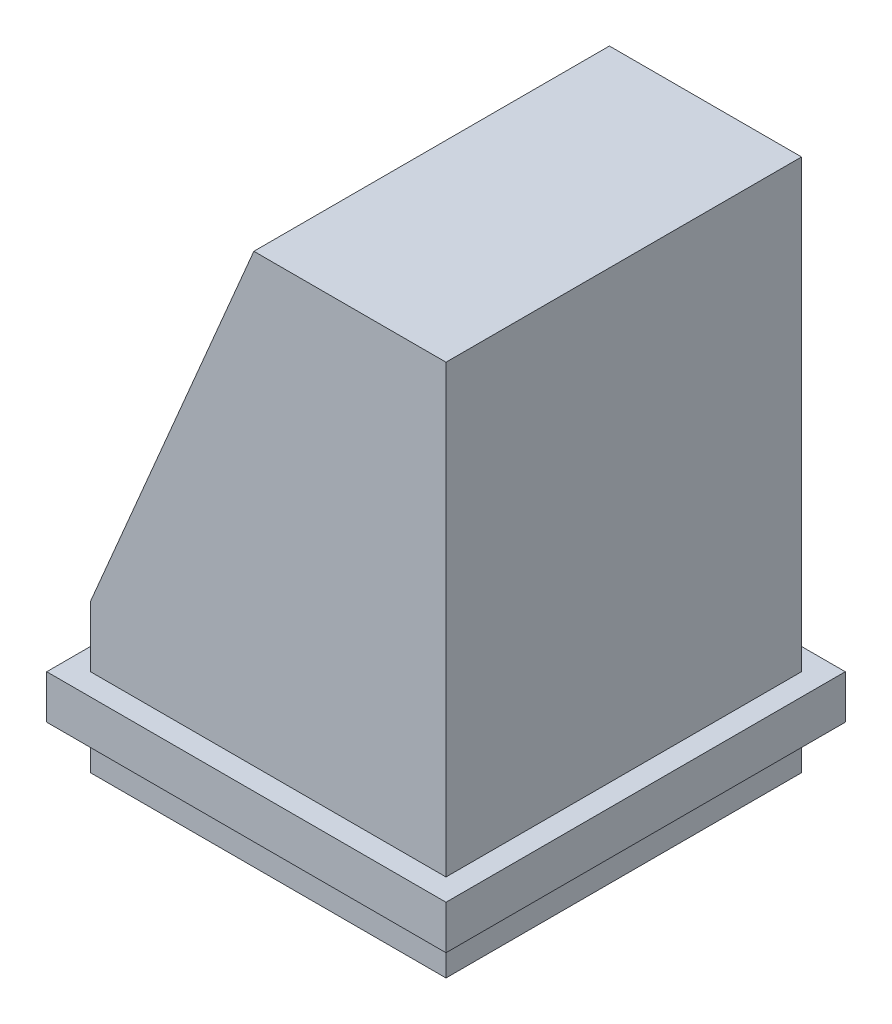
ISO-10303-21;
HEADER;
FILE_DESCRIPTION(('STEP AP214'),'2;1');
FILE_NAME('part.step','',(''),(''),'','','');
FILE_SCHEMA(('AUTOMOTIVE_DESIGN { 1 0 10303 214 1 1 1 1 }'));
ENDSEC;
DATA;
#1=APPLICATION_CONTEXT('core data for automotive mechanical design processes');
#2=APPLICATION_PROTOCOL_DEFINITION('international standard','automotive_design',2000,#1);
#3=PRODUCT_CONTEXT('',#1,'mechanical');
#4=PRODUCT('Part','Part','',(#3));
#5=PRODUCT_RELATED_PRODUCT_CATEGORY('part','',(#4));
#6=PRODUCT_DEFINITION_FORMATION('','',#4);
#7=PRODUCT_DEFINITION_CONTEXT('part definition',#1,'design');
#8=PRODUCT_DEFINITION('design','',#6,#7);
#9=PRODUCT_DEFINITION_SHAPE('','',#8);
#10=(LENGTH_UNIT() NAMED_UNIT(*) SI_UNIT(.MILLI.,.METRE.));
#11=(NAMED_UNIT(*) PLANE_ANGLE_UNIT() SI_UNIT($,.RADIAN.));
#12=(NAMED_UNIT(*) SI_UNIT($,.STERADIAN.) SOLID_ANGLE_UNIT());
#13=UNCERTAINTY_MEASURE_WITH_UNIT(LENGTH_MEASURE(1.E-05),#10,'distance_accuracy_value','');
#14=(GEOMETRIC_REPRESENTATION_CONTEXT(3) GLOBAL_UNCERTAINTY_ASSIGNED_CONTEXT((#13)) GLOBAL_UNIT_ASSIGNED_CONTEXT((#10,
#11,#12)) REPRESENTATION_CONTEXT('',''));
#15=CARTESIAN_POINT('',(0.,0.,0.));
#16=DIRECTION('',(0.,0.,1.));
#17=DIRECTION('',(1.,0.,0.));
#18=AXIS2_PLACEMENT_3D('',#15,#16,#17);
#19=CARTESIAN_POINT('',(0.,1219.2,0.));
#20=DIRECTION('',(1.,0.,0.));
#21=DIRECTION('',(0.,0.,-1.));
#22=AXIS2_PLACEMENT_3D('',#19,#20,#21);
#23=PLANE('',#22);
#24=DIRECTION('',(0.,-1.,0.));
#25=VECTOR('',#24,1.);
#26=CARTESIAN_POINT('',(0.,1219.2,0.));
#27=LINE('',#26,#25);
#28=CARTESIAN_POINT('',(0.,339.199999999993,0.));
#29=VERTEX_POINT('',#28);
#30=CARTESIAN_POINT('',(0.,200.000000000001,0.));
#31=VERTEX_POINT('',#30);
#32=EDGE_CURVE('E149',#29,#31,#27,.T.);
#33=ORIENTED_EDGE('',*,*,#32,.F.);
#34=DIRECTION('',(0.,0.,-1.));
#35=VECTOR('',#34,1.);
#36=CARTESIAN_POINT('',(0.,339.199999999993,0.));
#37=LINE('',#36,#35);
#38=CARTESIAN_POINT('',(0.,339.199999999993,-812.8));
#39=VERTEX_POINT('',#38);
#40=EDGE_CURVE('E41',#29,#39,#37,.T.);
#41=ORIENTED_EDGE('',*,*,#40,.T.);
#42=DIRECTION('',(0.,-1.,0.));
#43=VECTOR('',#42,1.);
#44=CARTESIAN_POINT('',(0.,1219.2,-812.8));
#45=LINE('',#44,#43);
#46=CARTESIAN_POINT('',(0.,200.000000000001,-812.8));
#47=VERTEX_POINT('',#46);
#48=EDGE_CURVE('E189',#39,#47,#45,.T.);
#49=ORIENTED_EDGE('',*,*,#48,.T.);
#50=DIRECTION('',(0.,0.,1.));
#51=VECTOR('',#50,1.);
#52=CARTESIAN_POINT('',(0.,200.,0.));
#53=LINE('',#52,#51);
#54=EDGE_CURVE('E251',#47,#31,#53,.T.);
#55=ORIENTED_EDGE('',*,*,#54,.T.);
#56=EDGE_LOOP('',(#33,#41,#49,#55));
#57=FACE_BOUND('',#56,.T.);
#58=ADVANCED_FACE('F33',(#57),#23,.F.);
#59=CARTESIAN_POINT('',(0.,1219.2,0.));
#60=DIRECTION('',(0.,0.,-1.));
#61=DIRECTION('',(-1.,0.,0.));
#62=AXIS2_PLACEMENT_3D('',#59,#60,#61);
#63=PLANE('',#62);
#64=DIRECTION('',(1.,0.,0.));
#65=VECTOR('',#64,1.);
#66=CARTESIAN_POINT('',(0.,1219.2,0.));
#67=LINE('',#66,#65);
#68=CARTESIAN_POINT('',(373.537838264453,1219.2,0.));
#69=VERTEX_POINT('',#68);
#70=CARTESIAN_POINT('',(812.8,1219.2,0.));
#71=VERTEX_POINT('',#70);
#72=EDGE_CURVE('E163',#69,#71,#67,.T.);
#73=ORIENTED_EDGE('',*,*,#72,.F.);
#74=DIRECTION('',(0.390731128489271,0.920504853452441,0.));
#75=VECTOR('',#74,1.);
#76=CARTESIAN_POINT('',(373.537838264453,1219.2,0.));
#77=LINE('',#76,#75);
#78=EDGE_CURVE('E55',#69,#29,#77,.F.);
#79=ORIENTED_EDGE('',*,*,#78,.T.);
#80=ORIENTED_EDGE('',*,*,#32,.T.);
#81=DIRECTION('',(1.,0.,0.));
#82=VECTOR('',#81,1.);
#83=CARTESIAN_POINT('',(0.,200.,0.));
#84=LINE('',#83,#82);
#85=CARTESIAN_POINT('',(812.8,200.000000000001,0.));
#86=VERTEX_POINT('',#85);
#87=EDGE_CURVE('E246',#31,#86,#84,.T.);
#88=ORIENTED_EDGE('',*,*,#87,.T.);
#89=DIRECTION('',(0.,-1.,0.));
#90=VECTOR('',#89,1.);
#91=CARTESIAN_POINT('',(812.8,1219.2,0.));
#92=LINE('',#91,#90);
#93=EDGE_CURVE('E150',#71,#86,#92,.T.);
#94=ORIENTED_EDGE('',*,*,#93,.F.);
#95=EDGE_LOOP('',(#73,#79,#80,#88,#94));
#96=FACE_BOUND('',#95,.T.);
#97=ADVANCED_FACE('F169',(#96),#63,.F.);
#98=CARTESIAN_POINT('',(812.8,1219.2,0.));
#99=DIRECTION('',(-1.,0.,0.));
#100=DIRECTION('',(0.,0.,1.));
#101=AXIS2_PLACEMENT_3D('',#98,#99,#100);
#102=PLANE('',#101);
#103=DIRECTION('',(0.,0.,-1.));
#104=VECTOR('',#103,1.);
#105=CARTESIAN_POINT('',(812.8,200.,0.));
#106=LINE('',#105,#104);
#107=CARTESIAN_POINT('',(812.8,200.,-812.8));
#108=VERTEX_POINT('',#107);
#109=EDGE_CURVE('E241',#86,#108,#106,.T.);
#110=ORIENTED_EDGE('',*,*,#109,.T.);
#111=DIRECTION('',(0.,-1.,0.));
#112=VECTOR('',#111,1.);
#113=CARTESIAN_POINT('',(812.8,1219.2,-812.8));
#114=LINE('',#113,#112);
#115=CARTESIAN_POINT('',(812.8,1219.2,-812.8));
#116=VERTEX_POINT('',#115);
#117=EDGE_CURVE('E191',#116,#108,#114,.T.);
#118=ORIENTED_EDGE('',*,*,#117,.F.);
#119=DIRECTION('',(0.,0.,-1.));
#120=VECTOR('',#119,1.);
#121=CARTESIAN_POINT('',(812.8,1219.2,0.));
#122=LINE('',#121,#120);
#123=EDGE_CURVE('E171',#71,#116,#122,.T.);
#124=ORIENTED_EDGE('',*,*,#123,.F.);
#125=ORIENTED_EDGE('',*,*,#93,.T.);
#126=EDGE_LOOP('',(#110,#118,#124,#125));
#127=FACE_BOUND('',#126,.T.);
#128=ADVANCED_FACE('F222',(#127),#102,.F.);
#129=CARTESIAN_POINT('',(0.,1219.2,-812.8));
#130=DIRECTION('',(0.,0.,1.));
#131=DIRECTION('',(1.,0.,0.));
#132=AXIS2_PLACEMENT_3D('',#129,#130,#131);
#133=PLANE('',#132);
#134=ORIENTED_EDGE('',*,*,#48,.F.);
#135=DIRECTION('',(-0.390731128489271,-0.920504853452441,0.));
#136=VECTOR('',#135,1.);
#137=CARTESIAN_POINT('',(373.537838264453,1219.2,-812.8));
#138=LINE('',#137,#136);
#139=CARTESIAN_POINT('',(373.537838264453,1219.2,-812.8));
#140=VERTEX_POINT('',#139);
#141=EDGE_CURVE('E11',#39,#140,#138,.F.);
#142=ORIENTED_EDGE('',*,*,#141,.T.);
#143=DIRECTION('',(-1.,0.,0.));
#144=VECTOR('',#143,1.);
#145=CARTESIAN_POINT('',(0.,1219.2,-812.8));
#146=LINE('',#145,#144);
#147=EDGE_CURVE('E166',#116,#140,#146,.T.);
#148=ORIENTED_EDGE('',*,*,#147,.F.);
#149=ORIENTED_EDGE('',*,*,#117,.T.);
#150=DIRECTION('',(-1.,0.,0.));
#151=VECTOR('',#150,1.);
#152=CARTESIAN_POINT('',(-2.22044604925031E-13,200.,-812.8));
#153=LINE('',#152,#151);
#154=EDGE_CURVE('E245',#108,#47,#153,.T.);
#155=ORIENTED_EDGE('',*,*,#154,.T.);
#156=EDGE_LOOP('',(#134,#142,#148,#149,#155));
#157=FACE_BOUND('',#156,.T.);
#158=ADVANCED_FACE('F213',(#157),#133,.F.);
#159=CARTESIAN_POINT('',(0.,1219.2,0.));
#160=DIRECTION('',(0.,-1.,0.));
#161=DIRECTION('',(0.,0.,-1.));
#162=AXIS2_PLACEMENT_3D('',#159,#160,#161);
#163=PLANE('',#162);
#164=ORIENTED_EDGE('',*,*,#147,.T.);
#165=DIRECTION('',(0.,0.,1.));
#166=VECTOR('',#165,1.);
#167=CARTESIAN_POINT('',(373.537838264453,1219.2,0.));
#168=LINE('',#167,#166);
#169=EDGE_CURVE('E152',#140,#69,#168,.T.);
#170=ORIENTED_EDGE('',*,*,#169,.T.);
#171=ORIENTED_EDGE('',*,*,#72,.T.);
#172=ORIENTED_EDGE('',*,*,#123,.T.);
#173=EDGE_LOOP('',(#164,#170,#171,#172));
#174=FACE_BOUND('',#173,.T.);
#175=ADVANCED_FACE('F162',(#174),#163,.F.);
#176=CARTESIAN_POINT('',(0.,200.,0.));
#177=DIRECTION('',(0.,-1.,0.));
#178=DIRECTION('',(0.,0.,-1.));
#179=AXIS2_PLACEMENT_3D('',#176,#177,#178);
#180=PLANE('',#179);
#181=DIRECTION('',(0.,0.,1.));
#182=VECTOR('',#181,1.);
#183=CARTESIAN_POINT('',(-50.,200.,50.));
#184=LINE('',#183,#182);
#185=CARTESIAN_POINT('',(-50.0000000000002,200.,-862.8));
#186=VERTEX_POINT('',#185);
#187=CARTESIAN_POINT('',(-50.,200.,50.));
#188=VERTEX_POINT('',#187);
#189=EDGE_CURVE('E261',#186,#188,#184,.T.);
#190=ORIENTED_EDGE('',*,*,#189,.T.);
#191=DIRECTION('',(1.,0.,0.));
#192=VECTOR('',#191,1.);
#193=CARTESIAN_POINT('',(-50.,200.,50.));
#194=LINE('',#193,#192);
#195=CARTESIAN_POINT('',(862.8,200.,50.));
#196=VERTEX_POINT('',#195);
#197=EDGE_CURVE('E264',#188,#196,#194,.T.);
#198=ORIENTED_EDGE('',*,*,#197,.T.);
#199=DIRECTION('',(0.,0.,-1.));
#200=VECTOR('',#199,1.);
#201=CARTESIAN_POINT('',(862.8,200.,50.));
#202=LINE('',#201,#200);
#203=CARTESIAN_POINT('',(862.8,200.,-862.8));
#204=VERTEX_POINT('',#203);
#205=EDGE_CURVE('E267',#196,#204,#202,.T.);
#206=ORIENTED_EDGE('',*,*,#205,.T.);
#207=DIRECTION('',(-1.,0.,0.));
#208=VECTOR('',#207,1.);
#209=CARTESIAN_POINT('',(-50.0000000000002,200.,-862.8));
#210=LINE('',#209,#208);
#211=EDGE_CURVE('E269',#204,#186,#210,.T.);
#212=ORIENTED_EDGE('',*,*,#211,.T.);
#213=EDGE_LOOP('',(#190,#198,#206,#212));
#214=FACE_BOUND('',#213,.T.);
#215=ORIENTED_EDGE('',*,*,#54,.F.);
#216=ORIENTED_EDGE('',*,*,#154,.F.);
#217=ORIENTED_EDGE('',*,*,#109,.F.);
#218=ORIENTED_EDGE('',*,*,#87,.F.);
#219=EDGE_LOOP('',(#215,#216,#217,#218));
#220=FACE_BOUND('',#219,.T.);
#221=ADVANCED_FACE('F249',(#214,#220),#180,.F.);
#222=CARTESIAN_POINT('',(0.,100.,0.));
#223=DIRECTION('',(0.,-1.,0.));
#224=DIRECTION('',(0.,0.,-1.));
#225=AXIS2_PLACEMENT_3D('',#222,#223,#224);
#226=PLANE('',#225);
#227=DIRECTION('',(0.,0.,1.));
#228=VECTOR('',#227,1.);
#229=CARTESIAN_POINT('',(-50.,100.,50.));
#230=LINE('',#229,#228);
#231=CARTESIAN_POINT('',(-50.0000000000002,100.,-862.8));
#232=VERTEX_POINT('',#231);
#233=CARTESIAN_POINT('',(-50.,100.,50.));
#234=VERTEX_POINT('',#233);
#235=EDGE_CURVE('E252',#232,#234,#230,.T.);
#236=ORIENTED_EDGE('',*,*,#235,.F.);
#237=DIRECTION('',(-1.,0.,0.));
#238=VECTOR('',#237,1.);
#239=CARTESIAN_POINT('',(-50.0000000000002,100.,-862.8));
#240=LINE('',#239,#238);
#241=CARTESIAN_POINT('',(862.8,100.,-862.8));
#242=VERTEX_POINT('',#241);
#243=EDGE_CURVE('E265',#242,#232,#240,.T.);
#244=ORIENTED_EDGE('',*,*,#243,.F.);
#245=DIRECTION('',(0.,0.,-1.));
#246=VECTOR('',#245,1.);
#247=CARTESIAN_POINT('',(862.8,100.,50.));
#248=LINE('',#247,#246);
#249=CARTESIAN_POINT('',(862.8,100.,50.));
#250=VERTEX_POINT('',#249);
#251=EDGE_CURVE('E273',#250,#242,#248,.T.);
#252=ORIENTED_EDGE('',*,*,#251,.F.);
#253=DIRECTION('',(1.,0.,0.));
#254=VECTOR('',#253,1.);
#255=CARTESIAN_POINT('',(-50.,100.,50.));
#256=LINE('',#255,#254);
#257=EDGE_CURVE('E255',#234,#250,#256,.T.);
#258=ORIENTED_EDGE('',*,*,#257,.F.);
#259=EDGE_LOOP('',(#236,#244,#252,#258));
#260=FACE_BOUND('',#259,.T.);
#261=DIRECTION('',(-1.,0.,0.));
#262=VECTOR('',#261,1.);
#263=CARTESIAN_POINT('',(-2.22044604925031E-13,100.,-812.8));
#264=LINE('',#263,#262);
#265=CARTESIAN_POINT('',(812.8,100.,-812.8));
#266=VERTEX_POINT('',#265);
#267=CARTESIAN_POINT('',(-2.22044604925031E-13,100.,-812.8));
#268=VERTEX_POINT('',#267);
#269=EDGE_CURVE('E131',#266,#268,#264,.T.);
#270=ORIENTED_EDGE('',*,*,#269,.T.);
#271=DIRECTION('',(0.,0.,1.));
#272=VECTOR('',#271,1.);
#273=CARTESIAN_POINT('',(0.,100.,0.));
#274=LINE('',#273,#272);
#275=CARTESIAN_POINT('',(0.,100.,0.));
#276=VERTEX_POINT('',#275);
#277=EDGE_CURVE('E125',#268,#276,#274,.T.);
#278=ORIENTED_EDGE('',*,*,#277,.T.);
#279=DIRECTION('',(1.,0.,0.));
#280=VECTOR('',#279,1.);
#281=CARTESIAN_POINT('',(0.,100.,0.));
#282=LINE('',#281,#280);
#283=CARTESIAN_POINT('',(812.8,100.,0.));
#284=VERTEX_POINT('',#283);
#285=EDGE_CURVE('E128',#276,#284,#282,.T.);
#286=ORIENTED_EDGE('',*,*,#285,.T.);
#287=DIRECTION('',(0.,0.,-1.));
#288=VECTOR('',#287,1.);
#289=CARTESIAN_POINT('',(812.8,100.,0.));
#290=LINE('',#289,#288);
#291=EDGE_CURVE('E143',#284,#266,#290,.T.);
#292=ORIENTED_EDGE('',*,*,#291,.T.);
#293=EDGE_LOOP('',(#270,#278,#286,#292));
#294=FACE_BOUND('',#293,.T.);
#295=ADVANCED_FACE('F127',(#260,#294),#226,.T.);
#296=CARTESIAN_POINT('',(-50.,200.,50.));
#297=DIRECTION('',(1.,0.,0.));
#298=DIRECTION('',(0.,0.,-1.));
#299=AXIS2_PLACEMENT_3D('',#296,#297,#298);
#300=PLANE('',#299);
#301=ORIENTED_EDGE('',*,*,#235,.T.);
#302=DIRECTION('',(0.,-1.,0.));
#303=VECTOR('',#302,1.);
#304=CARTESIAN_POINT('',(-50.,200.,50.));
#305=LINE('',#304,#303);
#306=EDGE_CURVE('E179',#188,#234,#305,.T.);
#307=ORIENTED_EDGE('',*,*,#306,.F.);
#308=ORIENTED_EDGE('',*,*,#189,.F.);
#309=DIRECTION('',(0.,-1.,0.));
#310=VECTOR('',#309,1.);
#311=CARTESIAN_POINT('',(-50.0000000000002,200.,-862.8));
#312=LINE('',#311,#310);
#313=EDGE_CURVE('E270',#186,#232,#312,.T.);
#314=ORIENTED_EDGE('',*,*,#313,.T.);
#315=EDGE_LOOP('',(#301,#307,#308,#314));
#316=FACE_BOUND('',#315,.T.);
#317=ADVANCED_FACE('F293',(#316),#300,.F.);
#318=CARTESIAN_POINT('',(-50.,200.,50.));
#319=DIRECTION('',(0.,0.,-1.));
#320=DIRECTION('',(-1.,0.,0.));
#321=AXIS2_PLACEMENT_3D('',#318,#319,#320);
#322=PLANE('',#321);
#323=ORIENTED_EDGE('',*,*,#257,.T.);
#324=DIRECTION('',(0.,-1.,0.));
#325=VECTOR('',#324,1.);
#326=CARTESIAN_POINT('',(862.8,200.,50.));
#327=LINE('',#326,#325);
#328=EDGE_CURVE('E280',#196,#250,#327,.T.);
#329=ORIENTED_EDGE('',*,*,#328,.F.);
#330=ORIENTED_EDGE('',*,*,#197,.F.);
#331=ORIENTED_EDGE('',*,*,#306,.T.);
#332=EDGE_LOOP('',(#323,#329,#330,#331));
#333=FACE_BOUND('',#332,.T.);
#334=ADVANCED_FACE('F289',(#333),#322,.F.);
#335=CARTESIAN_POINT('',(862.8,200.,50.));
#336=DIRECTION('',(-1.,0.,0.));
#337=DIRECTION('',(0.,0.,1.));
#338=AXIS2_PLACEMENT_3D('',#335,#336,#337);
#339=PLANE('',#338);
#340=ORIENTED_EDGE('',*,*,#251,.T.);
#341=DIRECTION('',(0.,-1.,0.));
#342=VECTOR('',#341,1.);
#343=CARTESIAN_POINT('',(862.8,200.,-862.8));
#344=LINE('',#343,#342);
#345=EDGE_CURVE('E278',#204,#242,#344,.T.);
#346=ORIENTED_EDGE('',*,*,#345,.F.);
#347=ORIENTED_EDGE('',*,*,#205,.F.);
#348=ORIENTED_EDGE('',*,*,#328,.T.);
#349=EDGE_LOOP('',(#340,#346,#347,#348));
#350=FACE_BOUND('',#349,.T.);
#351=ADVANCED_FACE('F214',(#350),#339,.F.);
#352=CARTESIAN_POINT('',(-50.0000000000002,200.,-862.8));
#353=DIRECTION('',(0.,0.,1.));
#354=DIRECTION('',(1.,0.,0.));
#355=AXIS2_PLACEMENT_3D('',#352,#353,#354);
#356=PLANE('',#355);
#357=ORIENTED_EDGE('',*,*,#243,.T.);
#358=ORIENTED_EDGE('',*,*,#313,.F.);
#359=ORIENTED_EDGE('',*,*,#211,.F.);
#360=ORIENTED_EDGE('',*,*,#345,.T.);
#361=EDGE_LOOP('',(#357,#358,#359,#360));
#362=FACE_BOUND('',#361,.T.);
#363=ADVANCED_FACE('F206',(#362),#356,.F.);
#364=CARTESIAN_POINT('',(0.,0.,0.));
#365=DIRECTION('',(0.,-1.,0.));
#366=DIRECTION('',(0.,0.,-1.));
#367=AXIS2_PLACEMENT_3D('',#364,#365,#366);
#368=PLANE('',#367);
#369=DIRECTION('',(0.,0.,1.));
#370=VECTOR('',#369,1.);
#371=CARTESIAN_POINT('',(0.,0.,0.));
#372=LINE('',#371,#370);
#373=CARTESIAN_POINT('',(0.,0.,-812.8));
#374=VERTEX_POINT('',#373);
#375=CARTESIAN_POINT('',(0.,0.,0.));
#376=VERTEX_POINT('',#375);
#377=EDGE_CURVE('E148',#374,#376,#372,.T.);
#378=ORIENTED_EDGE('',*,*,#377,.F.);
#379=DIRECTION('',(-1.,0.,0.));
#380=VECTOR('',#379,1.);
#381=CARTESIAN_POINT('',(0.,0.,-812.8));
#382=LINE('',#381,#380);
#383=CARTESIAN_POINT('',(812.8,0.,-812.8));
#384=VERTEX_POINT('',#383);
#385=EDGE_CURVE('E172',#384,#374,#382,.T.);
#386=ORIENTED_EDGE('',*,*,#385,.F.);
#387=DIRECTION('',(0.,0.,-1.));
#388=VECTOR('',#387,1.);
#389=CARTESIAN_POINT('',(812.8,0.,0.));
#390=LINE('',#389,#388);
#391=CARTESIAN_POINT('',(812.8,0.,0.));
#392=VERTEX_POINT('',#391);
#393=EDGE_CURVE('E176',#392,#384,#390,.T.);
#394=ORIENTED_EDGE('',*,*,#393,.F.);
#395=DIRECTION('',(1.,0.,0.));
#396=VECTOR('',#395,1.);
#397=CARTESIAN_POINT('',(0.,0.,0.));
#398=LINE('',#397,#396);
#399=EDGE_CURVE('E185',#376,#392,#398,.T.);
#400=ORIENTED_EDGE('',*,*,#399,.F.);
#401=EDGE_LOOP('',(#378,#386,#394,#400));
#402=FACE_BOUND('',#401,.T.);
#403=ADVANCED_FACE('F204',(#402),#368,.T.);
#404=EDGE_CURVE('E183',#268,#374,#45,.T.);
#405=ORIENTED_EDGE('',*,*,#404,.F.);
#406=ORIENTED_EDGE('',*,*,#269,.F.);
#407=EDGE_CURVE('E190',#266,#384,#114,.T.);
#408=ORIENTED_EDGE('',*,*,#407,.T.);
#409=ORIENTED_EDGE('',*,*,#385,.T.);
#410=EDGE_LOOP('',(#405,#406,#408,#409));
#411=FACE_BOUND('',#410,.T.);
#412=ADVANCED_FACE('F198',(#411),#133,.F.);
#413=ORIENTED_EDGE('',*,*,#407,.F.);
#414=ORIENTED_EDGE('',*,*,#291,.F.);
#415=EDGE_CURVE('E142',#284,#392,#92,.T.);
#416=ORIENTED_EDGE('',*,*,#415,.T.);
#417=ORIENTED_EDGE('',*,*,#393,.T.);
#418=EDGE_LOOP('',(#413,#414,#416,#417));
#419=FACE_BOUND('',#418,.T.);
#420=ADVANCED_FACE('F202',(#419),#102,.F.);
#421=ORIENTED_EDGE('',*,*,#415,.F.);
#422=ORIENTED_EDGE('',*,*,#285,.F.);
#423=EDGE_CURVE('E140',#276,#376,#27,.T.);
#424=ORIENTED_EDGE('',*,*,#423,.T.);
#425=ORIENTED_EDGE('',*,*,#399,.T.);
#426=EDGE_LOOP('',(#421,#422,#424,#425));
#427=FACE_BOUND('',#426,.T.);
#428=ADVANCED_FACE('F138',(#427),#63,.F.);
#429=ORIENTED_EDGE('',*,*,#423,.F.);
#430=ORIENTED_EDGE('',*,*,#277,.F.);
#431=ORIENTED_EDGE('',*,*,#404,.T.);
#432=ORIENTED_EDGE('',*,*,#377,.T.);
#433=EDGE_LOOP('',(#429,#430,#431,#432));
#434=FACE_BOUND('',#433,.T.);
#435=ADVANCED_FACE('F146',(#434),#23,.F.);
#436=CARTESIAN_POINT('',(373.537838264453,1219.2,0.));
#437=DIRECTION('',(0.920504853452441,-0.390731128489271,0.));
#438=DIRECTION('',(0.,0.,1.));
#439=AXIS2_PLACEMENT_3D('',#436,#437,#438);
#440=PLANE('',#439);
#441=ORIENTED_EDGE('',*,*,#141,.F.);
#442=ORIENTED_EDGE('',*,*,#40,.F.);
#443=ORIENTED_EDGE('',*,*,#78,.F.);
#444=ORIENTED_EDGE('',*,*,#169,.F.);
#445=EDGE_LOOP('',(#441,#442,#443,#444));
#446=FACE_BOUND('',#445,.T.);
#447=ADVANCED_FACE('F35',(#446),#440,.F.);
#448=CLOSED_SHELL('',(#58,#97,#128,#158,#175,#221,#295,#317,#334,#351,#363,#403,#412,#420,#428,
#435,#447));
#449=MANIFOLD_SOLID_BREP('B2',#448);
#450=ADVANCED_BREP_SHAPE_REPRESENTATION('',(#18,#449),#14);
#451=SHAPE_DEFINITION_REPRESENTATION(#9,#450);
ENDSEC;
END-ISO-10303-21;
